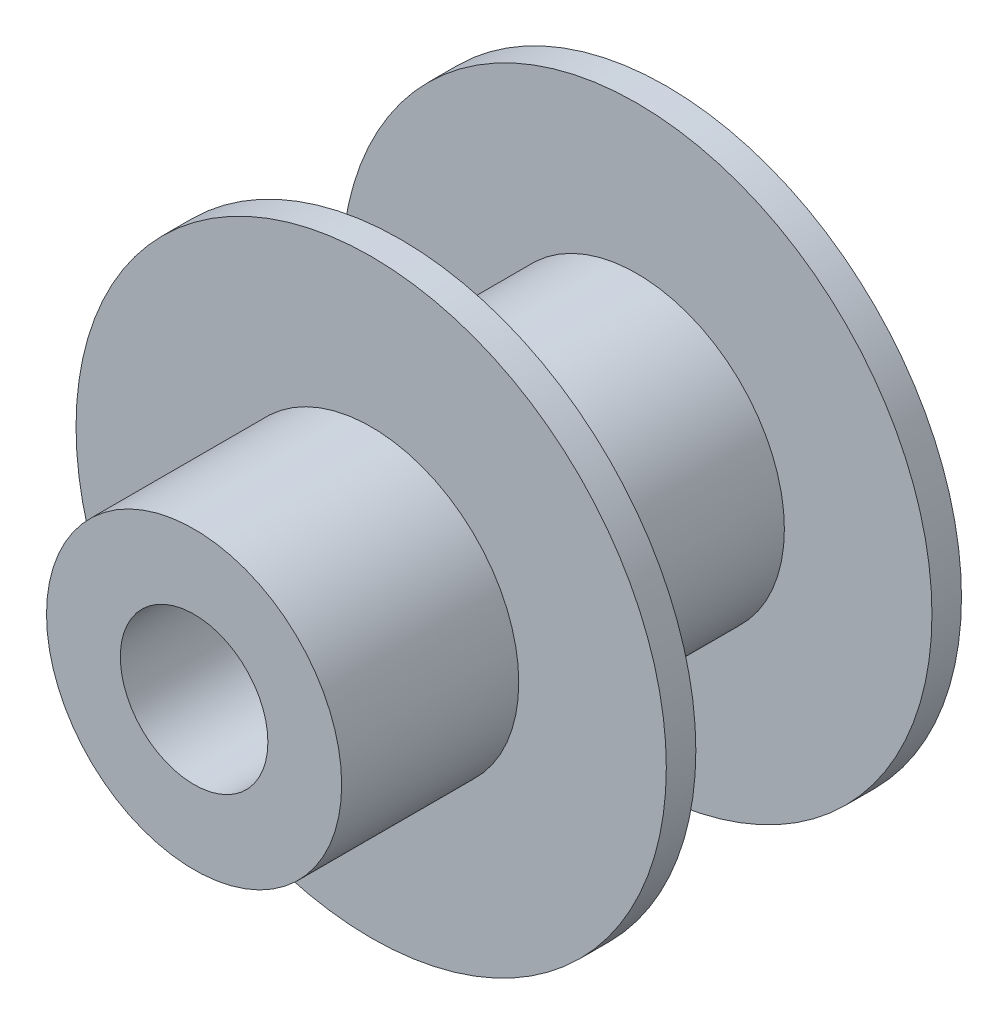
ISO-10303-21;
HEADER;
FILE_DESCRIPTION(('STEP AP214'),'2;1');
FILE_NAME('part.step','',(''),(''),'','','');
FILE_SCHEMA(('AUTOMOTIVE_DESIGN { 1 0 10303 214 1 1 1 1 }'));
ENDSEC;
DATA;
#1=APPLICATION_CONTEXT('core data for automotive mechanical design processes');
#2=APPLICATION_PROTOCOL_DEFINITION('international standard','automotive_design',2000,#1);
#3=PRODUCT_CONTEXT('',#1,'mechanical');
#4=PRODUCT('Part','Part','',(#3));
#5=PRODUCT_RELATED_PRODUCT_CATEGORY('part','',(#4));
#6=PRODUCT_DEFINITION_FORMATION('','',#4);
#7=PRODUCT_DEFINITION_CONTEXT('part definition',#1,'design');
#8=PRODUCT_DEFINITION('design','',#6,#7);
#9=PRODUCT_DEFINITION_SHAPE('','',#8);
#10=(LENGTH_UNIT() NAMED_UNIT(*) SI_UNIT(.MILLI.,.METRE.));
#11=(NAMED_UNIT(*) PLANE_ANGLE_UNIT() SI_UNIT($,.RADIAN.));
#12=(NAMED_UNIT(*) SI_UNIT($,.STERADIAN.) SOLID_ANGLE_UNIT());
#13=UNCERTAINTY_MEASURE_WITH_UNIT(LENGTH_MEASURE(1.E-05),#10,'distance_accuracy_value','');
#14=(GEOMETRIC_REPRESENTATION_CONTEXT(3) GLOBAL_UNCERTAINTY_ASSIGNED_CONTEXT((#13)) GLOBAL_UNIT_ASSIGNED_CONTEXT((#10,
#11,#12)) REPRESENTATION_CONTEXT('',''));
#15=CARTESIAN_POINT('',(0.,0.,0.));
#16=DIRECTION('',(0.,0.,1.));
#17=DIRECTION('',(1.,0.,0.));
#18=AXIS2_PLACEMENT_3D('',#15,#16,#17);
#19=CARTESIAN_POINT('',(0.,0.,10.));
#20=DIRECTION('',(0.,0.,-1.));
#21=DIRECTION('',(-1.,0.,0.));
#22=AXIS2_PLACEMENT_3D('',#19,#20,#21);
#23=CYLINDRICAL_SURFACE('',#22,10.);
#24=CARTESIAN_POINT('',(0.,0.,1.));
#25=DIRECTION('',(0.,0.,-1.));
#26=DIRECTION('',(-1.,0.,0.));
#27=AXIS2_PLACEMENT_3D('',#24,#25,#26);
#28=CIRCLE('',#27,10.);
#29=CARTESIAN_POINT('',(-10.,0.,1.));
#30=VERTEX_POINT('',#29);
#31=EDGE_CURVE('E62',#30,#30,#28,.T.);
#32=ORIENTED_EDGE('',*,*,#31,.T.);
#33=EDGE_LOOP('',(#32));
#34=FACE_BOUND('',#33,.T.);
#35=CARTESIAN_POINT('',(0.,0.,0.));
#36=DIRECTION('',(0.,0.,1.));
#37=DIRECTION('',(1.,0.,0.));
#38=AXIS2_PLACEMENT_3D('',#35,#36,#37);
#39=CIRCLE('',#38,10.);
#40=CARTESIAN_POINT('',(10.,0.,0.));
#41=VERTEX_POINT('',#40);
#42=EDGE_CURVE('E34',#41,#41,#39,.T.);
#43=ORIENTED_EDGE('',*,*,#42,.T.);
#44=EDGE_LOOP('',(#43));
#45=FACE_BOUND('',#44,.T.);
#46=ADVANCED_FACE('F30',(#34,#45),#23,.T.);
#47=CARTESIAN_POINT('',(0.,0.,9.));
#48=DIRECTION('',(0.,0.,-1.));
#49=DIRECTION('',(-1.,0.,0.));
#50=AXIS2_PLACEMENT_3D('',#47,#48,#49);
#51=CIRCLE('',#50,10.);
#52=CARTESIAN_POINT('',(-10.,0.,9.));
#53=VERTEX_POINT('',#52);
#54=EDGE_CURVE('E59',#53,#53,#51,.T.);
#55=ORIENTED_EDGE('',*,*,#54,.F.);
#56=EDGE_LOOP('',(#55));
#57=FACE_BOUND('',#56,.T.);
#58=CARTESIAN_POINT('',(0.,0.,10.));
#59=DIRECTION('',(0.,0.,1.));
#60=DIRECTION('',(1.,0.,0.));
#61=AXIS2_PLACEMENT_3D('',#58,#59,#60);
#62=CIRCLE('',#61,10.);
#63=CARTESIAN_POINT('',(10.,0.,10.));
#64=VERTEX_POINT('',#63);
#65=EDGE_CURVE('E38',#64,#64,#62,.T.);
#66=ORIENTED_EDGE('',*,*,#65,.F.);
#67=EDGE_LOOP('',(#66));
#68=FACE_BOUND('',#67,.T.);
#69=ADVANCED_FACE('F32',(#57,#68),#23,.T.);
#70=CARTESIAN_POINT('',(0.,0.,10.));
#71=DIRECTION('',(0.,0.,1.));
#72=DIRECTION('',(1.,0.,0.));
#73=AXIS2_PLACEMENT_3D('',#70,#71,#72);
#74=PLANE('',#73);
#75=CARTESIAN_POINT('',(0.,0.,10.));
#76=DIRECTION('',(0.,0.,1.));
#77=DIRECTION('',(1.,0.,0.));
#78=AXIS2_PLACEMENT_3D('',#75,#76,#77);
#79=CIRCLE('',#78,5.);
#80=CARTESIAN_POINT('',(5.,0.,10.));
#81=VERTEX_POINT('',#80);
#82=EDGE_CURVE('E10',#81,#81,#79,.T.);
#83=ORIENTED_EDGE('',*,*,#82,.F.);
#84=EDGE_LOOP('',(#83));
#85=FACE_BOUND('',#84,.T.);
#86=ORIENTED_EDGE('',*,*,#65,.T.);
#87=EDGE_LOOP('',(#86));
#88=FACE_BOUND('',#87,.T.);
#89=ADVANCED_FACE('F89',(#85,#88),#74,.T.);
#90=CARTESIAN_POINT('',(0.,0.,0.));
#91=DIRECTION('',(0.,0.,1.));
#92=DIRECTION('',(1.,0.,0.));
#93=AXIS2_PLACEMENT_3D('',#90,#91,#92);
#94=PLANE('',#93);
#95=CARTESIAN_POINT('',(0.,0.,0.));
#96=DIRECTION('',(0.,0.,1.));
#97=DIRECTION('',(1.,0.,0.));
#98=AXIS2_PLACEMENT_3D('',#95,#96,#97);
#99=CIRCLE('',#98,2.5);
#100=CARTESIAN_POINT('',(2.5,0.,0.));
#101=VERTEX_POINT('',#100);
#102=EDGE_CURVE('E47',#101,#101,#99,.T.);
#103=ORIENTED_EDGE('',*,*,#102,.T.);
#104=EDGE_LOOP('',(#103));
#105=FACE_BOUND('',#104,.T.);
#106=ORIENTED_EDGE('',*,*,#42,.F.);
#107=EDGE_LOOP('',(#106));
#108=FACE_BOUND('',#107,.T.);
#109=ADVANCED_FACE('F93',(#105,#108),#94,.F.);
#110=CARTESIAN_POINT('',(0.,0.,16.));
#111=DIRECTION('',(0.,0.,-1.));
#112=DIRECTION('',(-1.,0.,0.));
#113=AXIS2_PLACEMENT_3D('',#110,#111,#112);
#114=CYLINDRICAL_SURFACE('',#113,5.);
#115=CARTESIAN_POINT('',(0.,0.,16.));
#116=DIRECTION('',(0.,0.,1.));
#117=DIRECTION('',(1.,0.,0.));
#118=AXIS2_PLACEMENT_3D('',#115,#116,#117);
#119=CIRCLE('',#118,5.);
#120=CARTESIAN_POINT('',(5.,0.,16.));
#121=VERTEX_POINT('',#120);
#122=EDGE_CURVE('E44',#121,#121,#119,.T.);
#123=ORIENTED_EDGE('',*,*,#122,.F.);
#124=EDGE_LOOP('',(#123));
#125=FACE_BOUND('',#124,.T.);
#126=ORIENTED_EDGE('',*,*,#82,.T.);
#127=EDGE_LOOP('',(#126));
#128=FACE_BOUND('',#127,.T.);
#129=ADVANCED_FACE('F99',(#125,#128),#114,.T.);
#130=CARTESIAN_POINT('',(0.,0.,16.));
#131=DIRECTION('',(0.,0.,1.));
#132=DIRECTION('',(1.,0.,0.));
#133=AXIS2_PLACEMENT_3D('',#130,#131,#132);
#134=PLANE('',#133);
#135=CARTESIAN_POINT('',(0.,0.,16.));
#136=DIRECTION('',(0.,0.,1.));
#137=DIRECTION('',(1.,0.,0.));
#138=AXIS2_PLACEMENT_3D('',#135,#136,#137);
#139=CIRCLE('',#138,2.5);
#140=CARTESIAN_POINT('',(2.5,0.,16.));
#141=VERTEX_POINT('',#140);
#142=EDGE_CURVE('E48',#141,#141,#139,.T.);
#143=ORIENTED_EDGE('',*,*,#142,.F.);
#144=EDGE_LOOP('',(#143));
#145=FACE_BOUND('',#144,.T.);
#146=ORIENTED_EDGE('',*,*,#122,.T.);
#147=EDGE_LOOP('',(#146));
#148=FACE_BOUND('',#147,.T.);
#149=ADVANCED_FACE('F136',(#145,#148),#134,.T.);
#150=CARTESIAN_POINT('',(0.,0.,0.));
#151=DIRECTION('',(0.,0.,1.));
#152=DIRECTION('',(1.,0.,0.));
#153=AXIS2_PLACEMENT_3D('',#150,#151,#152);
#154=CYLINDRICAL_SURFACE('',#153,2.5);
#155=ORIENTED_EDGE('',*,*,#102,.F.);
#156=EDGE_LOOP('',(#155));
#157=FACE_BOUND('',#156,.T.);
#158=ORIENTED_EDGE('',*,*,#142,.T.);
#159=EDGE_LOOP('',(#158));
#160=FACE_BOUND('',#159,.T.);
#161=ADVANCED_FACE('F72',(#157,#160),#154,.F.);
#162=CARTESIAN_POINT('',(0.,10.,1.));
#163=DIRECTION('',(0.,0.,-1.));
#164=DIRECTION('',(-1.,0.,0.));
#165=AXIS2_PLACEMENT_3D('',#162,#163,#164);
#166=PLANE('',#165);
#167=ORIENTED_EDGE('',*,*,#31,.F.);
#168=EDGE_LOOP('',(#167));
#169=FACE_BOUND('',#168,.T.);
#170=CARTESIAN_POINT('',(0.,0.,0.999999999999999));
#171=DIRECTION('',(0.,0.,-1.));
#172=DIRECTION('',(-1.,0.,0.));
#173=AXIS2_PLACEMENT_3D('',#170,#171,#172);
#174=CIRCLE('',#173,5.);
#175=CARTESIAN_POINT('',(-5.,0.,0.999999999999999));
#176=VERTEX_POINT('',#175);
#177=EDGE_CURVE('E51',#176,#176,#174,.T.);
#178=ORIENTED_EDGE('',*,*,#177,.T.);
#179=EDGE_LOOP('',(#178));
#180=FACE_BOUND('',#179,.T.);
#181=ADVANCED_FACE('F68',(#169,#180),#166,.F.);
#182=CARTESIAN_POINT('',(0.,0.,0.));
#183=DIRECTION('',(0.,0.,-1.));
#184=DIRECTION('',(-1.,0.,0.));
#185=AXIS2_PLACEMENT_3D('',#182,#183,#184);
#186=CYLINDRICAL_SURFACE('',#185,5.);
#187=ORIENTED_EDGE('',*,*,#177,.F.);
#188=EDGE_LOOP('',(#187));
#189=FACE_BOUND('',#188,.T.);
#190=CARTESIAN_POINT('',(0.,0.,9.));
#191=DIRECTION('',(0.,0.,-1.));
#192=DIRECTION('',(-1.,0.,0.));
#193=AXIS2_PLACEMENT_3D('',#190,#191,#192);
#194=CIRCLE('',#193,5.);
#195=CARTESIAN_POINT('',(-5.,0.,9.));
#196=VERTEX_POINT('',#195);
#197=EDGE_CURVE('E56',#196,#196,#194,.T.);
#198=ORIENTED_EDGE('',*,*,#197,.T.);
#199=EDGE_LOOP('',(#198));
#200=FACE_BOUND('',#199,.T.);
#201=ADVANCED_FACE('F71',(#189,#200),#186,.T.);
#202=CARTESIAN_POINT('',(0.,10.,9.));
#203=DIRECTION('',(0.,0.,1.));
#204=DIRECTION('',(1.,0.,0.));
#205=AXIS2_PLACEMENT_3D('',#202,#203,#204);
#206=PLANE('',#205);
#207=ORIENTED_EDGE('',*,*,#197,.F.);
#208=EDGE_LOOP('',(#207));
#209=FACE_BOUND('',#208,.T.);
#210=ORIENTED_EDGE('',*,*,#54,.T.);
#211=EDGE_LOOP('',(#210));
#212=FACE_BOUND('',#211,.T.);
#213=ADVANCED_FACE('F78',(#209,#212),#206,.F.);
#214=CLOSED_SHELL('',(#46,#69,#89,#109,#129,#149,#161,#181,#201,#213));
#215=MANIFOLD_SOLID_BREP('B2',#214);
#216=ADVANCED_BREP_SHAPE_REPRESENTATION('',(#18,#215),#14);
#217=SHAPE_DEFINITION_REPRESENTATION(#9,#216);
ENDSEC;
END-ISO-10303-21;
